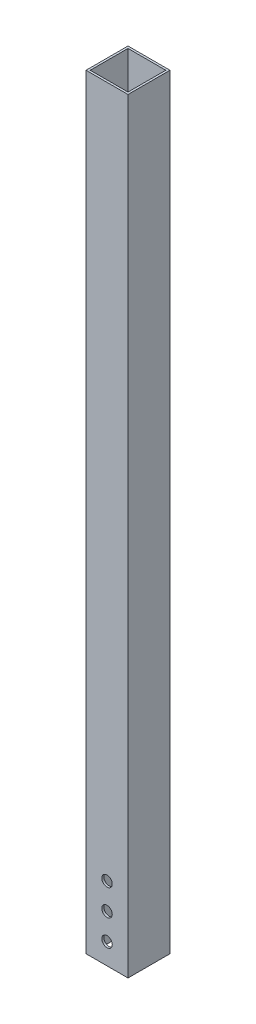
ISO-10303-21;
HEADER;
FILE_DESCRIPTION(('STEP AP214'),'2;1');
FILE_NAME('part.step','',(''),(''),'','','');
FILE_SCHEMA(('AUTOMOTIVE_DESIGN { 1 0 10303 214 1 1 1 1 }'));
ENDSEC;
DATA;
#1=APPLICATION_CONTEXT('core data for automotive mechanical design processes');
#2=APPLICATION_PROTOCOL_DEFINITION('international standard','automotive_design',2000,#1);
#3=PRODUCT_CONTEXT('',#1,'mechanical');
#4=PRODUCT('Part','Part','',(#3));
#5=PRODUCT_RELATED_PRODUCT_CATEGORY('part','',(#4));
#6=PRODUCT_DEFINITION_FORMATION('','',#4);
#7=PRODUCT_DEFINITION_CONTEXT('part definition',#1,'design');
#8=PRODUCT_DEFINITION('design','',#6,#7);
#9=PRODUCT_DEFINITION_SHAPE('','',#8);
#10=(LENGTH_UNIT() NAMED_UNIT(*) SI_UNIT(.MILLI.,.METRE.));
#11=(NAMED_UNIT(*) PLANE_ANGLE_UNIT() SI_UNIT($,.RADIAN.));
#12=(NAMED_UNIT(*) SI_UNIT($,.STERADIAN.) SOLID_ANGLE_UNIT());
#13=UNCERTAINTY_MEASURE_WITH_UNIT(LENGTH_MEASURE(1.E-05),#10,'distance_accuracy_value','');
#14=(GEOMETRIC_REPRESENTATION_CONTEXT(3) GLOBAL_UNCERTAINTY_ASSIGNED_CONTEXT((#13)) GLOBAL_UNIT_ASSIGNED_CONTEXT((#10,
#11,#12)) REPRESENTATION_CONTEXT('',''));
#15=CARTESIAN_POINT('',(0.,0.,0.));
#16=DIRECTION('',(0.,0.,1.));
#17=DIRECTION('',(1.,0.,0.));
#18=AXIS2_PLACEMENT_3D('',#15,#16,#17);
#19=CARTESIAN_POINT('',(-10.,364.53,10.));
#20=DIRECTION('',(1.,0.,0.));
#21=DIRECTION('',(0.,0.,-1.));
#22=AXIS2_PLACEMENT_3D('',#19,#20,#21);
#23=PLANE('',#22);
#24=DIRECTION('',(0.,0.,1.));
#25=VECTOR('',#24,1.);
#26=CARTESIAN_POINT('',(-10.,0.,10.));
#27=LINE('',#26,#25);
#28=CARTESIAN_POINT('',(-10.,0.,-10.));
#29=VERTEX_POINT('',#28);
#30=CARTESIAN_POINT('',(-10.,0.,10.));
#31=VERTEX_POINT('',#30);
#32=EDGE_CURVE('E158',#29,#31,#27,.T.);
#33=ORIENTED_EDGE('',*,*,#32,.T.);
#34=DIRECTION('',(0.,-1.,0.));
#35=VECTOR('',#34,1.);
#36=CARTESIAN_POINT('',(-10.,364.53,10.));
#37=LINE('',#36,#35);
#38=CARTESIAN_POINT('',(-10.,364.53,10.));
#39=VERTEX_POINT('',#38);
#40=EDGE_CURVE('E12',#39,#31,#37,.T.);
#41=ORIENTED_EDGE('',*,*,#40,.F.);
#42=DIRECTION('',(0.,0.,1.));
#43=VECTOR('',#42,1.);
#44=CARTESIAN_POINT('',(-10.,364.53,10.));
#45=LINE('',#44,#43);
#46=CARTESIAN_POINT('',(-10.,364.53,-10.));
#47=VERTEX_POINT('',#46);
#48=EDGE_CURVE('E131',#47,#39,#45,.T.);
#49=ORIENTED_EDGE('',*,*,#48,.F.);
#50=DIRECTION('',(0.,-1.,0.));
#51=VECTOR('',#50,1.);
#52=CARTESIAN_POINT('',(-10.,364.53,-10.));
#53=LINE('',#52,#51);
#54=EDGE_CURVE('E165',#47,#29,#53,.T.);
#55=ORIENTED_EDGE('',*,*,#54,.T.);
#56=EDGE_LOOP('',(#33,#41,#49,#55));
#57=FACE_BOUND('',#56,.T.);
#58=ADVANCED_FACE('F50',(#57),#23,.F.);
#59=CARTESIAN_POINT('',(-10.,364.53,10.));
#60=DIRECTION('',(0.,0.,-1.));
#61=DIRECTION('',(-1.,0.,0.));
#62=AXIS2_PLACEMENT_3D('',#59,#60,#61);
#63=PLANE('',#62);
#64=CARTESIAN_POINT('',(0.,10.,10.));
#65=DIRECTION('',(0.,0.,1.));
#66=DIRECTION('',(1.,0.,0.));
#67=AXIS2_PLACEMENT_3D('',#64,#65,#66);
#68=CIRCLE('',#67,2.5);
#69=CARTESIAN_POINT('',(2.5,10.,10.));
#70=VERTEX_POINT('',#69);
#71=EDGE_CURVE('E228',#70,#70,#68,.T.);
#72=ORIENTED_EDGE('',*,*,#71,.F.);
#73=EDGE_LOOP('',(#72));
#74=FACE_BOUND('',#73,.T.);
#75=CARTESIAN_POINT('',(0.,22.5,10.));
#76=DIRECTION('',(0.,0.,1.));
#77=DIRECTION('',(1.,0.,0.));
#78=AXIS2_PLACEMENT_3D('',#75,#76,#77);
#79=CIRCLE('',#78,2.5);
#80=CARTESIAN_POINT('',(2.5,22.5,10.));
#81=VERTEX_POINT('',#80);
#82=EDGE_CURVE('E222',#81,#81,#79,.T.);
#83=ORIENTED_EDGE('',*,*,#82,.F.);
#84=EDGE_LOOP('',(#83));
#85=FACE_BOUND('',#84,.T.);
#86=CARTESIAN_POINT('',(0.,35.,10.));
#87=DIRECTION('',(0.,0.,1.));
#88=DIRECTION('',(1.,0.,0.));
#89=AXIS2_PLACEMENT_3D('',#86,#87,#88);
#90=CIRCLE('',#89,2.5);
#91=CARTESIAN_POINT('',(2.5,35.,10.));
#92=VERTEX_POINT('',#91);
#93=EDGE_CURVE('E216',#92,#92,#90,.T.);
#94=ORIENTED_EDGE('',*,*,#93,.F.);
#95=EDGE_LOOP('',(#94));
#96=FACE_BOUND('',#95,.T.);
#97=DIRECTION('',(1.,0.,0.));
#98=VECTOR('',#97,1.);
#99=CARTESIAN_POINT('',(-10.,0.,10.));
#100=LINE('',#99,#98);
#101=CARTESIAN_POINT('',(10.,0.,10.));
#102=VERTEX_POINT('',#101);
#103=EDGE_CURVE('E136',#31,#102,#100,.T.);
#104=ORIENTED_EDGE('',*,*,#103,.T.);
#105=DIRECTION('',(0.,-1.,0.));
#106=VECTOR('',#105,1.);
#107=CARTESIAN_POINT('',(10.,364.53,10.));
#108=LINE('',#107,#106);
#109=CARTESIAN_POINT('',(10.,364.53,10.));
#110=VERTEX_POINT('',#109);
#111=EDGE_CURVE('E60',#110,#102,#108,.T.);
#112=ORIENTED_EDGE('',*,*,#111,.F.);
#113=DIRECTION('',(1.,0.,0.));
#114=VECTOR('',#113,1.);
#115=CARTESIAN_POINT('',(-10.,364.53,10.));
#116=LINE('',#115,#114);
#117=EDGE_CURVE('E125',#39,#110,#116,.T.);
#118=ORIENTED_EDGE('',*,*,#117,.F.);
#119=ORIENTED_EDGE('',*,*,#40,.T.);
#120=EDGE_LOOP('',(#104,#112,#118,#119));
#121=FACE_BOUND('',#120,.T.);
#122=ADVANCED_FACE('F135',(#74,#85,#96,#121),#63,.F.);
#123=CARTESIAN_POINT('',(10.,364.53,-10.));
#124=DIRECTION('',(-1.,0.,0.));
#125=DIRECTION('',(0.,0.,1.));
#126=AXIS2_PLACEMENT_3D('',#123,#124,#125);
#127=PLANE('',#126);
#128=DIRECTION('',(0.,0.,-1.));
#129=VECTOR('',#128,1.);
#130=CARTESIAN_POINT('',(10.,0.,-10.));
#131=LINE('',#130,#129);
#132=CARTESIAN_POINT('',(10.,0.,-10.));
#133=VERTEX_POINT('',#132);
#134=EDGE_CURVE('E98',#102,#133,#131,.T.);
#135=ORIENTED_EDGE('',*,*,#134,.T.);
#136=DIRECTION('',(0.,-1.,0.));
#137=VECTOR('',#136,1.);
#138=CARTESIAN_POINT('',(10.,364.53,-10.));
#139=LINE('',#138,#137);
#140=CARTESIAN_POINT('',(10.,364.53,-10.));
#141=VERTEX_POINT('',#140);
#142=EDGE_CURVE('E137',#141,#133,#139,.T.);
#143=ORIENTED_EDGE('',*,*,#142,.F.);
#144=DIRECTION('',(0.,0.,-1.));
#145=VECTOR('',#144,1.);
#146=CARTESIAN_POINT('',(10.,364.53,-10.));
#147=LINE('',#146,#145);
#148=EDGE_CURVE('E129',#110,#141,#147,.T.);
#149=ORIENTED_EDGE('',*,*,#148,.F.);
#150=ORIENTED_EDGE('',*,*,#111,.T.);
#151=EDGE_LOOP('',(#135,#143,#149,#150));
#152=FACE_BOUND('',#151,.T.);
#153=ADVANCED_FACE('F139',(#152),#127,.F.);
#154=CARTESIAN_POINT('',(-9.,364.53,9.));
#155=DIRECTION('',(0.,0.,-1.));
#156=DIRECTION('',(-1.,0.,0.));
#157=AXIS2_PLACEMENT_3D('',#154,#155,#156);
#158=PLANE('',#157);
#159=CARTESIAN_POINT('',(0.,10.,9.));
#160=DIRECTION('',(0.,0.,-1.));
#161=DIRECTION('',(-1.,0.,0.));
#162=AXIS2_PLACEMENT_3D('',#159,#160,#161);
#163=CIRCLE('',#162,2.5);
#164=CARTESIAN_POINT('',(-2.5,10.,9.));
#165=VERTEX_POINT('',#164);
#166=EDGE_CURVE('E149',#165,#165,#163,.T.);
#167=ORIENTED_EDGE('',*,*,#166,.F.);
#168=EDGE_LOOP('',(#167));
#169=FACE_BOUND('',#168,.T.);
#170=CARTESIAN_POINT('',(0.,22.5,9.));
#171=DIRECTION('',(0.,0.,-1.));
#172=DIRECTION('',(-1.,0.,0.));
#173=AXIS2_PLACEMENT_3D('',#170,#171,#172);
#174=CIRCLE('',#173,2.5);
#175=CARTESIAN_POINT('',(-2.5,22.5,9.));
#176=VERTEX_POINT('',#175);
#177=EDGE_CURVE('E203',#176,#176,#174,.T.);
#178=ORIENTED_EDGE('',*,*,#177,.F.);
#179=EDGE_LOOP('',(#178));
#180=FACE_BOUND('',#179,.T.);
#181=CARTESIAN_POINT('',(0.,35.,9.));
#182=DIRECTION('',(0.,0.,-1.));
#183=DIRECTION('',(-1.,0.,0.));
#184=AXIS2_PLACEMENT_3D('',#181,#182,#183);
#185=CIRCLE('',#184,2.5);
#186=CARTESIAN_POINT('',(-2.5,35.,9.));
#187=VERTEX_POINT('',#186);
#188=EDGE_CURVE('E209',#187,#187,#185,.T.);
#189=ORIENTED_EDGE('',*,*,#188,.F.);
#190=EDGE_LOOP('',(#189));
#191=FACE_BOUND('',#190,.T.);
#192=DIRECTION('',(1.,0.,0.));
#193=VECTOR('',#192,1.);
#194=CARTESIAN_POINT('',(-9.,0.,9.));
#195=LINE('',#194,#193);
#196=CARTESIAN_POINT('',(-9.,0.,9.));
#197=VERTEX_POINT('',#196);
#198=CARTESIAN_POINT('',(9.,0.,9.));
#199=VERTEX_POINT('',#198);
#200=EDGE_CURVE('E145',#197,#199,#195,.T.);
#201=ORIENTED_EDGE('',*,*,#200,.F.);
#202=DIRECTION('',(0.,-1.,0.));
#203=VECTOR('',#202,1.);
#204=CARTESIAN_POINT('',(-9.,364.53,9.));
#205=LINE('',#204,#203);
#206=CARTESIAN_POINT('',(-9.,364.53,9.));
#207=VERTEX_POINT('',#206);
#208=EDGE_CURVE('E54',#207,#197,#205,.T.);
#209=ORIENTED_EDGE('',*,*,#208,.F.);
#210=DIRECTION('',(1.,0.,0.));
#211=VECTOR('',#210,1.);
#212=CARTESIAN_POINT('',(-9.,364.53,9.));
#213=LINE('',#212,#211);
#214=CARTESIAN_POINT('',(9.,364.53,9.));
#215=VERTEX_POINT('',#214);
#216=EDGE_CURVE('E164',#207,#215,#213,.T.);
#217=ORIENTED_EDGE('',*,*,#216,.T.);
#218=DIRECTION('',(0.,-1.,0.));
#219=VECTOR('',#218,1.);
#220=CARTESIAN_POINT('',(9.,364.53,9.));
#221=LINE('',#220,#219);
#222=EDGE_CURVE('E141',#215,#199,#221,.T.);
#223=ORIENTED_EDGE('',*,*,#222,.T.);
#224=EDGE_LOOP('',(#201,#209,#217,#223));
#225=FACE_BOUND('',#224,.T.);
#226=ADVANCED_FACE('F52',(#169,#180,#191,#225),#158,.T.);
#227=CARTESIAN_POINT('',(-9.,364.53,9.));
#228=DIRECTION('',(1.,0.,0.));
#229=DIRECTION('',(0.,0.,-1.));
#230=AXIS2_PLACEMENT_3D('',#227,#228,#229);
#231=PLANE('',#230);
#232=DIRECTION('',(0.,0.,1.));
#233=VECTOR('',#232,1.);
#234=CARTESIAN_POINT('',(-9.,0.,9.));
#235=LINE('',#234,#233);
#236=CARTESIAN_POINT('',(-9.,0.,-9.));
#237=VERTEX_POINT('',#236);
#238=EDGE_CURVE('E148',#237,#197,#235,.T.);
#239=ORIENTED_EDGE('',*,*,#238,.F.);
#240=DIRECTION('',(0.,-1.,0.));
#241=VECTOR('',#240,1.);
#242=CARTESIAN_POINT('',(-9.,364.53,-9.));
#243=LINE('',#242,#241);
#244=CARTESIAN_POINT('',(-9.,364.53,-9.));
#245=VERTEX_POINT('',#244);
#246=EDGE_CURVE('E170',#245,#237,#243,.T.);
#247=ORIENTED_EDGE('',*,*,#246,.F.);
#248=DIRECTION('',(0.,0.,1.));
#249=VECTOR('',#248,1.);
#250=CARTESIAN_POINT('',(-9.,364.53,9.));
#251=LINE('',#250,#249);
#252=EDGE_CURVE('E179',#245,#207,#251,.T.);
#253=ORIENTED_EDGE('',*,*,#252,.T.);
#254=ORIENTED_EDGE('',*,*,#208,.T.);
#255=EDGE_LOOP('',(#239,#247,#253,#254));
#256=FACE_BOUND('',#255,.T.);
#257=ADVANCED_FACE('F177',(#256),#231,.T.);
#258=CARTESIAN_POINT('',(9.,364.53,-9.));
#259=DIRECTION('',(0.,0.,1.));
#260=DIRECTION('',(1.,0.,0.));
#261=AXIS2_PLACEMENT_3D('',#258,#259,#260);
#262=PLANE('',#261);
#263=CARTESIAN_POINT('',(0.,10.,-9.));
#264=DIRECTION('',(0.,0.,1.));
#265=DIRECTION('',(1.,0.,0.));
#266=AXIS2_PLACEMENT_3D('',#263,#264,#265);
#267=CIRCLE('',#266,2.5);
#268=CARTESIAN_POINT('',(2.5,10.,-9.));
#269=VERTEX_POINT('',#268);
#270=EDGE_CURVE('E200',#269,#269,#267,.T.);
#271=ORIENTED_EDGE('',*,*,#270,.F.);
#272=EDGE_LOOP('',(#271));
#273=FACE_BOUND('',#272,.T.);
#274=CARTESIAN_POINT('',(0.,22.5,-9.));
#275=DIRECTION('',(0.,0.,1.));
#276=DIRECTION('',(1.,0.,0.));
#277=AXIS2_PLACEMENT_3D('',#274,#275,#276);
#278=CIRCLE('',#277,2.5);
#279=CARTESIAN_POINT('',(2.5,22.5,-9.));
#280=VERTEX_POINT('',#279);
#281=EDGE_CURVE('E206',#280,#280,#278,.T.);
#282=ORIENTED_EDGE('',*,*,#281,.F.);
#283=EDGE_LOOP('',(#282));
#284=FACE_BOUND('',#283,.T.);
#285=CARTESIAN_POINT('',(0.,35.,-9.));
#286=DIRECTION('',(0.,0.,1.));
#287=DIRECTION('',(1.,0.,0.));
#288=AXIS2_PLACEMENT_3D('',#285,#286,#287);
#289=CIRCLE('',#288,2.5);
#290=CARTESIAN_POINT('',(2.5,35.,-9.));
#291=VERTEX_POINT('',#290);
#292=EDGE_CURVE('E212',#291,#291,#289,.T.);
#293=ORIENTED_EDGE('',*,*,#292,.F.);
#294=EDGE_LOOP('',(#293));
#295=FACE_BOUND('',#294,.T.);
#296=DIRECTION('',(-1.,0.,0.));
#297=VECTOR('',#296,1.);
#298=CARTESIAN_POINT('',(9.,0.,-9.));
#299=LINE('',#298,#297);
#300=CARTESIAN_POINT('',(9.,0.,-9.));
#301=VERTEX_POINT('',#300);
#302=EDGE_CURVE('E152',#301,#237,#299,.T.);
#303=ORIENTED_EDGE('',*,*,#302,.F.);
#304=DIRECTION('',(0.,-1.,0.));
#305=VECTOR('',#304,1.);
#306=CARTESIAN_POINT('',(9.,364.53,-9.));
#307=LINE('',#306,#305);
#308=CARTESIAN_POINT('',(9.,364.53,-9.));
#309=VERTEX_POINT('',#308);
#310=EDGE_CURVE('E169',#309,#301,#307,.T.);
#311=ORIENTED_EDGE('',*,*,#310,.F.);
#312=DIRECTION('',(-1.,0.,0.));
#313=VECTOR('',#312,1.);
#314=CARTESIAN_POINT('',(9.,364.53,-9.));
#315=LINE('',#314,#313);
#316=EDGE_CURVE('E186',#309,#245,#315,.T.);
#317=ORIENTED_EDGE('',*,*,#316,.T.);
#318=ORIENTED_EDGE('',*,*,#246,.T.);
#319=EDGE_LOOP('',(#303,#311,#317,#318));
#320=FACE_BOUND('',#319,.T.);
#321=ADVANCED_FACE('F184',(#273,#284,#295,#320),#262,.T.);
#322=CARTESIAN_POINT('',(9.,364.53,-9.));
#323=DIRECTION('',(-1.,0.,0.));
#324=DIRECTION('',(0.,0.,1.));
#325=AXIS2_PLACEMENT_3D('',#322,#323,#324);
#326=PLANE('',#325);
#327=DIRECTION('',(0.,0.,-1.));
#328=VECTOR('',#327,1.);
#329=CARTESIAN_POINT('',(9.,0.,-9.));
#330=LINE('',#329,#328);
#331=EDGE_CURVE('E155',#199,#301,#330,.T.);
#332=ORIENTED_EDGE('',*,*,#331,.F.);
#333=ORIENTED_EDGE('',*,*,#222,.F.);
#334=DIRECTION('',(0.,0.,-1.));
#335=VECTOR('',#334,1.);
#336=CARTESIAN_POINT('',(9.,364.53,-9.));
#337=LINE('',#336,#335);
#338=EDGE_CURVE('E191',#215,#309,#337,.T.);
#339=ORIENTED_EDGE('',*,*,#338,.T.);
#340=ORIENTED_EDGE('',*,*,#310,.T.);
#341=EDGE_LOOP('',(#332,#333,#339,#340));
#342=FACE_BOUND('',#341,.T.);
#343=ADVANCED_FACE('F193',(#342),#326,.T.);
#344=CARTESIAN_POINT('',(10.,364.53,-10.));
#345=DIRECTION('',(0.,0.,1.));
#346=DIRECTION('',(1.,0.,0.));
#347=AXIS2_PLACEMENT_3D('',#344,#345,#346);
#348=PLANE('',#347);
#349=CARTESIAN_POINT('',(0.,10.,-10.));
#350=DIRECTION('',(0.,0.,1.));
#351=DIRECTION('',(1.,0.,0.));
#352=AXIS2_PLACEMENT_3D('',#349,#350,#351);
#353=CIRCLE('',#352,2.5);
#354=CARTESIAN_POINT('',(2.5,10.,-10.));
#355=VERTEX_POINT('',#354);
#356=EDGE_CURVE('E215',#355,#355,#353,.T.);
#357=ORIENTED_EDGE('',*,*,#356,.T.);
#358=EDGE_LOOP('',(#357));
#359=FACE_BOUND('',#358,.T.);
#360=CARTESIAN_POINT('',(0.,22.5,-10.));
#361=DIRECTION('',(0.,0.,1.));
#362=DIRECTION('',(1.,0.,0.));
#363=AXIS2_PLACEMENT_3D('',#360,#361,#362);
#364=CIRCLE('',#363,2.5);
#365=CARTESIAN_POINT('',(2.5,22.5,-10.));
#366=VERTEX_POINT('',#365);
#367=EDGE_CURVE('E225',#366,#366,#364,.T.);
#368=ORIENTED_EDGE('',*,*,#367,.T.);
#369=EDGE_LOOP('',(#368));
#370=FACE_BOUND('',#369,.T.);
#371=CARTESIAN_POINT('',(0.,35.,-10.));
#372=DIRECTION('',(0.,0.,1.));
#373=DIRECTION('',(1.,0.,0.));
#374=AXIS2_PLACEMENT_3D('',#371,#372,#373);
#375=CIRCLE('',#374,2.5);
#376=CARTESIAN_POINT('',(2.5,35.,-10.));
#377=VERTEX_POINT('',#376);
#378=EDGE_CURVE('E219',#377,#377,#375,.T.);
#379=ORIENTED_EDGE('',*,*,#378,.T.);
#380=EDGE_LOOP('',(#379));
#381=FACE_BOUND('',#380,.T.);
#382=DIRECTION('',(-1.,0.,0.));
#383=VECTOR('',#382,1.);
#384=CARTESIAN_POINT('',(10.,0.,-10.));
#385=LINE('',#384,#383);
#386=EDGE_CURVE('E104',#133,#29,#385,.T.);
#387=ORIENTED_EDGE('',*,*,#386,.T.);
#388=ORIENTED_EDGE('',*,*,#54,.F.);
#389=DIRECTION('',(-1.,0.,0.));
#390=VECTOR('',#389,1.);
#391=CARTESIAN_POINT('',(10.,364.53,-10.));
#392=LINE('',#391,#390);
#393=EDGE_CURVE('E69',#141,#47,#392,.T.);
#394=ORIENTED_EDGE('',*,*,#393,.F.);
#395=ORIENTED_EDGE('',*,*,#142,.T.);
#396=EDGE_LOOP('',(#387,#388,#394,#395));
#397=FACE_BOUND('',#396,.T.);
#398=ADVANCED_FACE('F234',(#359,#370,#381,#397),#348,.F.);
#399=CARTESIAN_POINT('',(0.,364.53,0.));
#400=DIRECTION('',(0.,1.,0.));
#401=DIRECTION('',(0.,0.,1.));
#402=AXIS2_PLACEMENT_3D('',#399,#400,#401);
#403=PLANE('',#402);
#404=ORIENTED_EDGE('',*,*,#216,.F.);
#405=ORIENTED_EDGE('',*,*,#252,.F.);
#406=ORIENTED_EDGE('',*,*,#316,.F.);
#407=ORIENTED_EDGE('',*,*,#338,.F.);
#408=EDGE_LOOP('',(#404,#405,#406,#407));
#409=FACE_BOUND('',#408,.T.);
#410=ORIENTED_EDGE('',*,*,#48,.T.);
#411=ORIENTED_EDGE('',*,*,#117,.T.);
#412=ORIENTED_EDGE('',*,*,#148,.T.);
#413=ORIENTED_EDGE('',*,*,#393,.T.);
#414=EDGE_LOOP('',(#410,#411,#412,#413));
#415=FACE_BOUND('',#414,.T.);
#416=ADVANCED_FACE('F127',(#409,#415),#403,.T.);
#417=CARTESIAN_POINT('',(0.,0.,0.));
#418=DIRECTION('',(0.,1.,0.));
#419=DIRECTION('',(0.,0.,1.));
#420=AXIS2_PLACEMENT_3D('',#417,#418,#419);
#421=PLANE('',#420);
#422=ORIENTED_EDGE('',*,*,#200,.T.);
#423=ORIENTED_EDGE('',*,*,#331,.T.);
#424=ORIENTED_EDGE('',*,*,#302,.T.);
#425=ORIENTED_EDGE('',*,*,#238,.T.);
#426=EDGE_LOOP('',(#422,#423,#424,#425));
#427=FACE_BOUND('',#426,.T.);
#428=ORIENTED_EDGE('',*,*,#32,.F.);
#429=ORIENTED_EDGE('',*,*,#386,.F.);
#430=ORIENTED_EDGE('',*,*,#134,.F.);
#431=ORIENTED_EDGE('',*,*,#103,.F.);
#432=EDGE_LOOP('',(#428,#429,#430,#431));
#433=FACE_BOUND('',#432,.T.);
#434=ADVANCED_FACE('F182',(#427,#433),#421,.F.);
#435=CARTESIAN_POINT('',(0.,35.,-10.));
#436=DIRECTION('',(0.,0.,1.));
#437=DIRECTION('',(1.,0.,0.));
#438=AXIS2_PLACEMENT_3D('',#435,#436,#437);
#439=CYLINDRICAL_SURFACE('',#438,2.5);
#440=ORIENTED_EDGE('',*,*,#292,.T.);
#441=EDGE_LOOP('',(#440));
#442=FACE_BOUND('',#441,.T.);
#443=ORIENTED_EDGE('',*,*,#378,.F.);
#444=EDGE_LOOP('',(#443));
#445=FACE_BOUND('',#444,.T.);
#446=ADVANCED_FACE('F251',(#442,#445),#439,.F.);
#447=CARTESIAN_POINT('',(0.,22.5,-10.));
#448=DIRECTION('',(0.,0.,1.));
#449=DIRECTION('',(1.,0.,0.));
#450=AXIS2_PLACEMENT_3D('',#447,#448,#449);
#451=CYLINDRICAL_SURFACE('',#450,2.5);
#452=ORIENTED_EDGE('',*,*,#281,.T.);
#453=EDGE_LOOP('',(#452));
#454=FACE_BOUND('',#453,.T.);
#455=ORIENTED_EDGE('',*,*,#367,.F.);
#456=EDGE_LOOP('',(#455));
#457=FACE_BOUND('',#456,.T.);
#458=ADVANCED_FACE('F240',(#454,#457),#451,.F.);
#459=CARTESIAN_POINT('',(0.,10.,-10.));
#460=DIRECTION('',(0.,0.,1.));
#461=DIRECTION('',(1.,0.,0.));
#462=AXIS2_PLACEMENT_3D('',#459,#460,#461);
#463=CYLINDRICAL_SURFACE('',#462,2.5);
#464=ORIENTED_EDGE('',*,*,#270,.T.);
#465=EDGE_LOOP('',(#464));
#466=FACE_BOUND('',#465,.T.);
#467=ORIENTED_EDGE('',*,*,#356,.F.);
#468=EDGE_LOOP('',(#467));
#469=FACE_BOUND('',#468,.T.);
#470=ADVANCED_FACE('F237',(#466,#469),#463,.F.);
#471=ORIENTED_EDGE('',*,*,#188,.T.);
#472=EDGE_LOOP('',(#471));
#473=FACE_BOUND('',#472,.T.);
#474=ORIENTED_EDGE('',*,*,#93,.T.);
#475=EDGE_LOOP('',(#474));
#476=FACE_BOUND('',#475,.T.);
#477=ADVANCED_FACE('F239',(#473,#476),#439,.F.);
#478=ORIENTED_EDGE('',*,*,#177,.T.);
#479=EDGE_LOOP('',(#478));
#480=FACE_BOUND('',#479,.T.);
#481=ORIENTED_EDGE('',*,*,#82,.T.);
#482=EDGE_LOOP('',(#481));
#483=FACE_BOUND('',#482,.T.);
#484=ADVANCED_FACE('F248',(#480,#483),#451,.F.);
#485=ORIENTED_EDGE('',*,*,#166,.T.);
#486=EDGE_LOOP('',(#485));
#487=FACE_BOUND('',#486,.T.);
#488=ORIENTED_EDGE('',*,*,#71,.T.);
#489=EDGE_LOOP('',(#488));
#490=FACE_BOUND('',#489,.T.);
#491=ADVANCED_FACE('F243',(#487,#490),#463,.F.);
#492=CLOSED_SHELL('',(#58,#122,#153,#226,#257,#321,#343,#398,#416,#434,#446,#458,#470,#477,#484,#491));
#493=MANIFOLD_SOLID_BREP('B2',#492);
#494=ADVANCED_BREP_SHAPE_REPRESENTATION('',(#18,#493),#14);
#495=SHAPE_DEFINITION_REPRESENTATION(#9,#494);
ENDSEC;
END-ISO-10303-21;
